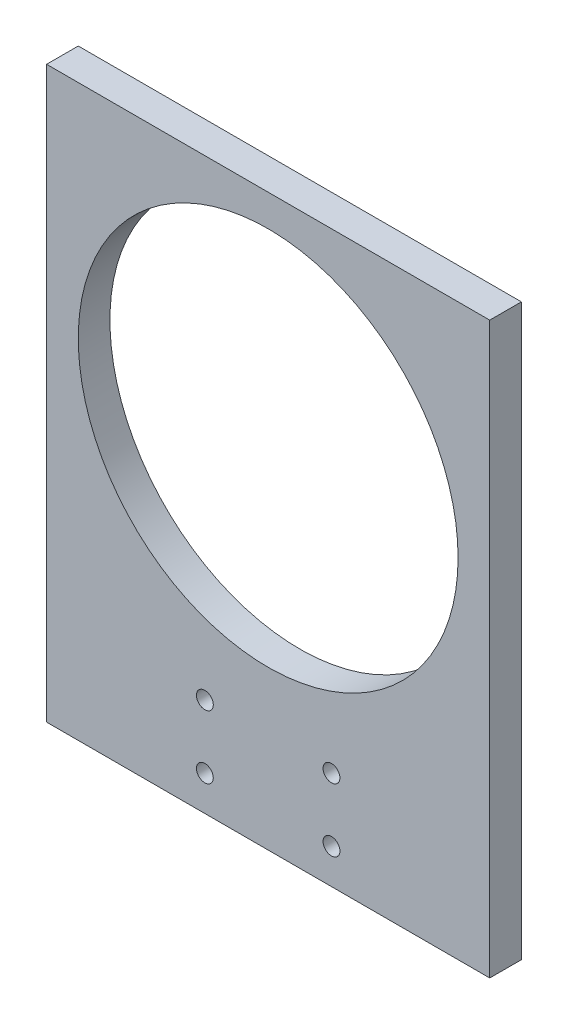
ISO-10303-21;
HEADER;
FILE_DESCRIPTION(('STEP AP214'),'2;1');
FILE_NAME('part.step','',(''),(''),'','','');
FILE_SCHEMA(('AUTOMOTIVE_DESIGN { 1 0 10303 214 1 1 1 1 }'));
ENDSEC;
DATA;
#1=APPLICATION_CONTEXT('core data for automotive mechanical design processes');
#2=APPLICATION_PROTOCOL_DEFINITION('international standard','automotive_design',2000,#1);
#3=PRODUCT_CONTEXT('',#1,'mechanical');
#4=PRODUCT('Part','Part','',(#3));
#5=PRODUCT_RELATED_PRODUCT_CATEGORY('part','',(#4));
#6=PRODUCT_DEFINITION_FORMATION('','',#4);
#7=PRODUCT_DEFINITION_CONTEXT('part definition',#1,'design');
#8=PRODUCT_DEFINITION('design','',#6,#7);
#9=PRODUCT_DEFINITION_SHAPE('','',#8);
#10=(LENGTH_UNIT() NAMED_UNIT(*) SI_UNIT(.MILLI.,.METRE.));
#11=(NAMED_UNIT(*) PLANE_ANGLE_UNIT() SI_UNIT($,.RADIAN.));
#12=(NAMED_UNIT(*) SI_UNIT($,.STERADIAN.) SOLID_ANGLE_UNIT());
#13=UNCERTAINTY_MEASURE_WITH_UNIT(LENGTH_MEASURE(1.E-05),#10,'distance_accuracy_value','');
#14=(GEOMETRIC_REPRESENTATION_CONTEXT(3) GLOBAL_UNCERTAINTY_ASSIGNED_CONTEXT((#13)) GLOBAL_UNIT_ASSIGNED_CONTEXT((#10,
#11,#12)) REPRESENTATION_CONTEXT('',''));
#15=CARTESIAN_POINT('',(0.,0.,0.));
#16=DIRECTION('',(0.,0.,1.));
#17=DIRECTION('',(1.,0.,0.));
#18=AXIS2_PLACEMENT_3D('',#15,#16,#17);
#19=CARTESIAN_POINT('',(0.,0.,12.7));
#20=DIRECTION('',(0.,0.,1.));
#21=DIRECTION('',(1.,0.,0.));
#22=AXIS2_PLACEMENT_3D('',#19,#20,#21);
#23=PLANE('',#22);
#24=CARTESIAN_POINT('',(114.3,14.0362831713124,12.7));
#25=DIRECTION('',(0.,0.,-1.));
#26=DIRECTION('',(-1.,0.,0.));
#27=AXIS2_PLACEMENT_3D('',#24,#25,#26);
#28=CIRCLE('',#27,3.37819999999999);
#29=CARTESIAN_POINT('',(110.9218,14.0362831713124,12.7));
#30=VERTEX_POINT('',#29);
#31=EDGE_CURVE('E232',#30,#30,#28,.T.);
#32=ORIENTED_EDGE('',*,*,#31,.T.);
#33=EDGE_LOOP('',(#32));
#34=FACE_BOUND('',#33,.T.);
#35=CARTESIAN_POINT('',(114.3,39.4362831713124,12.7));
#36=DIRECTION('',(0.,0.,-1.));
#37=DIRECTION('',(-1.,0.,0.));
#38=AXIS2_PLACEMENT_3D('',#35,#36,#37);
#39=CIRCLE('',#38,3.37819999999999);
#40=CARTESIAN_POINT('',(110.9218,39.4362831713124,12.7));
#41=VERTEX_POINT('',#40);
#42=EDGE_CURVE('E240',#41,#41,#39,.T.);
#43=ORIENTED_EDGE('',*,*,#42,.T.);
#44=EDGE_LOOP('',(#43));
#45=FACE_BOUND('',#44,.T.);
#46=CARTESIAN_POINT('',(63.5,39.4362831713124,12.7));
#47=DIRECTION('',(0.,0.,1.));
#48=DIRECTION('',(1.,0.,0.));
#49=AXIS2_PLACEMENT_3D('',#46,#47,#48);
#50=CIRCLE('',#49,3.37819999999999);
#51=CARTESIAN_POINT('',(66.8782,39.4362831713124,12.7));
#52=VERTEX_POINT('',#51);
#53=EDGE_CURVE('E252',#52,#52,#50,.T.);
#54=ORIENTED_EDGE('',*,*,#53,.F.);
#55=EDGE_LOOP('',(#54));
#56=FACE_BOUND('',#55,.T.);
#57=DIRECTION('',(1.,0.,0.));
#58=VECTOR('',#57,1.);
#59=CARTESIAN_POINT('',(0.,228.6,12.7));
#60=LINE('',#59,#58);
#61=CARTESIAN_POINT('',(0.,228.6,12.7));
#62=VERTEX_POINT('',#61);
#63=CARTESIAN_POINT('',(177.8,228.6,12.7));
#64=VERTEX_POINT('',#63);
#65=EDGE_CURVE('E171',#62,#64,#60,.T.);
#66=ORIENTED_EDGE('',*,*,#65,.F.);
#67=DIRECTION('',(0.,1.,0.));
#68=VECTOR('',#67,1.);
#69=CARTESIAN_POINT('',(0.,0.,12.7));
#70=LINE('',#69,#68);
#71=CARTESIAN_POINT('',(0.,0.,12.7));
#72=VERTEX_POINT('',#71);
#73=EDGE_CURVE('E161',#72,#62,#70,.T.);
#74=ORIENTED_EDGE('',*,*,#73,.F.);
#75=DIRECTION('',(1.,0.,0.));
#76=VECTOR('',#75,1.);
#77=CARTESIAN_POINT('',(0.,0.,12.7));
#78=LINE('',#77,#76);
#79=CARTESIAN_POINT('',(177.8,0.,12.7));
#80=VERTEX_POINT('',#79);
#81=EDGE_CURVE('E158',#72,#80,#78,.T.);
#82=ORIENTED_EDGE('',*,*,#81,.T.);
#83=DIRECTION('',(0.,1.,0.));
#84=VECTOR('',#83,1.);
#85=CARTESIAN_POINT('',(177.8,0.,12.7));
#86=LINE('',#85,#84);
#87=EDGE_CURVE('E155',#80,#64,#86,.T.);
#88=ORIENTED_EDGE('',*,*,#87,.T.);
#89=EDGE_LOOP('',(#66,#74,#82,#88));
#90=FACE_BOUND('',#89,.T.);
#91=CARTESIAN_POINT('',(88.9,139.7,12.7));
#92=DIRECTION('',(0.,0.,1.));
#93=DIRECTION('',(1.,0.,0.));
#94=AXIS2_PLACEMENT_3D('',#91,#92,#93);
#95=CIRCLE('',#94,76.2);
#96=CARTESIAN_POINT('',(165.1,139.7,12.7));
#97=VERTEX_POINT('',#96);
#98=EDGE_CURVE('E182',#97,#97,#95,.T.);
#99=ORIENTED_EDGE('',*,*,#98,.F.);
#100=EDGE_LOOP('',(#99));
#101=FACE_BOUND('',#100,.T.);
#102=CARTESIAN_POINT('',(63.5,14.0362831713124,12.7));
#103=DIRECTION('',(0.,0.,1.));
#104=DIRECTION('',(1.,0.,0.));
#105=AXIS2_PLACEMENT_3D('',#102,#103,#104);
#106=CIRCLE('',#105,3.37819999999999);
#107=CARTESIAN_POINT('',(66.8782,14.0362831713124,12.7));
#108=VERTEX_POINT('',#107);
#109=EDGE_CURVE('E246',#108,#108,#106,.T.);
#110=ORIENTED_EDGE('',*,*,#109,.F.);
#111=EDGE_LOOP('',(#110));
#112=FACE_BOUND('',#111,.T.);
#113=ADVANCED_FACE('F112',(#34,#45,#56,#90,#101,#112),#23,.T.);
#114=CARTESIAN_POINT('',(0.,0.,0.));
#115=DIRECTION('',(0.,0.,1.));
#116=DIRECTION('',(1.,0.,0.));
#117=AXIS2_PLACEMENT_3D('',#114,#115,#116);
#118=PLANE('',#117);
#119=CARTESIAN_POINT('',(114.3,14.0362831713124,0.));
#120=DIRECTION('',(0.,0.,-1.));
#121=DIRECTION('',(-1.,0.,0.));
#122=AXIS2_PLACEMENT_3D('',#119,#120,#121);
#123=CIRCLE('',#122,3.37819999999999);
#124=CARTESIAN_POINT('',(110.9218,14.0362831713124,0.));
#125=VERTEX_POINT('',#124);
#126=EDGE_CURVE('E235',#125,#125,#123,.T.);
#127=ORIENTED_EDGE('',*,*,#126,.F.);
#128=EDGE_LOOP('',(#127));
#129=FACE_BOUND('',#128,.T.);
#130=CARTESIAN_POINT('',(114.3,39.4362831713124,0.));
#131=DIRECTION('',(0.,0.,-1.));
#132=DIRECTION('',(-1.,0.,0.));
#133=AXIS2_PLACEMENT_3D('',#130,#131,#132);
#134=CIRCLE('',#133,3.37819999999999);
#135=CARTESIAN_POINT('',(110.9218,39.4362831713124,0.));
#136=VERTEX_POINT('',#135);
#137=EDGE_CURVE('E237',#136,#136,#134,.T.);
#138=ORIENTED_EDGE('',*,*,#137,.F.);
#139=EDGE_LOOP('',(#138));
#140=FACE_BOUND('',#139,.T.);
#141=DIRECTION('',(1.,0.,0.));
#142=VECTOR('',#141,1.);
#143=CARTESIAN_POINT('',(0.,228.6,0.));
#144=LINE('',#143,#142);
#145=CARTESIAN_POINT('',(0.,228.6,0.));
#146=VERTEX_POINT('',#145);
#147=CARTESIAN_POINT('',(177.8,228.6,0.));
#148=VERTEX_POINT('',#147);
#149=EDGE_CURVE('E178',#146,#148,#144,.T.);
#150=ORIENTED_EDGE('',*,*,#149,.T.);
#151=DIRECTION('',(0.,1.,0.));
#152=VECTOR('',#151,1.);
#153=CARTESIAN_POINT('',(177.8,0.,0.));
#154=LINE('',#153,#152);
#155=CARTESIAN_POINT('',(177.8,0.,0.));
#156=VERTEX_POINT('',#155);
#157=EDGE_CURVE('E181',#156,#148,#154,.T.);
#158=ORIENTED_EDGE('',*,*,#157,.F.);
#159=DIRECTION('',(1.,0.,0.));
#160=VECTOR('',#159,1.);
#161=CARTESIAN_POINT('',(0.,0.,0.));
#162=LINE('',#161,#160);
#163=CARTESIAN_POINT('',(0.,0.,0.));
#164=VERTEX_POINT('',#163);
#165=EDGE_CURVE('E166',#164,#156,#162,.T.);
#166=ORIENTED_EDGE('',*,*,#165,.F.);
#167=DIRECTION('',(0.,1.,0.));
#168=VECTOR('',#167,1.);
#169=CARTESIAN_POINT('',(0.,0.,0.));
#170=LINE('',#169,#168);
#171=EDGE_CURVE('E173',#164,#146,#170,.T.);
#172=ORIENTED_EDGE('',*,*,#171,.T.);
#173=EDGE_LOOP('',(#150,#158,#166,#172));
#174=FACE_BOUND('',#173,.T.);
#175=CARTESIAN_POINT('',(88.9,139.7,0.));
#176=DIRECTION('',(0.,0.,1.));
#177=DIRECTION('',(1.,0.,0.));
#178=AXIS2_PLACEMENT_3D('',#175,#176,#177);
#179=CIRCLE('',#178,76.2);
#180=CARTESIAN_POINT('',(165.1,139.7,0.));
#181=VERTEX_POINT('',#180);
#182=EDGE_CURVE('E255',#181,#181,#179,.T.);
#183=ORIENTED_EDGE('',*,*,#182,.T.);
#184=EDGE_LOOP('',(#183));
#185=FACE_BOUND('',#184,.T.);
#186=CARTESIAN_POINT('',(63.5,39.4362831713124,0.));
#187=DIRECTION('',(0.,0.,1.));
#188=DIRECTION('',(1.,0.,0.));
#189=AXIS2_PLACEMENT_3D('',#186,#187,#188);
#190=CIRCLE('',#189,3.37819999999999);
#191=CARTESIAN_POINT('',(66.8782,39.4362831713124,0.));
#192=VERTEX_POINT('',#191);
#193=EDGE_CURVE('E249',#192,#192,#190,.T.);
#194=ORIENTED_EDGE('',*,*,#193,.T.);
#195=EDGE_LOOP('',(#194));
#196=FACE_BOUND('',#195,.T.);
#197=CARTESIAN_POINT('',(63.5,14.0362831713124,0.));
#198=DIRECTION('',(0.,0.,1.));
#199=DIRECTION('',(1.,0.,0.));
#200=AXIS2_PLACEMENT_3D('',#197,#198,#199);
#201=CIRCLE('',#200,3.37819999999999);
#202=CARTESIAN_POINT('',(66.8782,14.0362831713124,0.));
#203=VERTEX_POINT('',#202);
#204=EDGE_CURVE('E243',#203,#203,#201,.T.);
#205=ORIENTED_EDGE('',*,*,#204,.T.);
#206=EDGE_LOOP('',(#205));
#207=FACE_BOUND('',#206,.T.);
#208=ADVANCED_FACE('F188',(#129,#140,#174,#185,#196,#207),#118,.F.);
#209=CARTESIAN_POINT('',(0.,228.6,12.7));
#210=DIRECTION('',(0.,1.,0.));
#211=DIRECTION('',(0.,0.,1.));
#212=AXIS2_PLACEMENT_3D('',#209,#210,#211);
#213=PLANE('',#212);
#214=ORIENTED_EDGE('',*,*,#149,.F.);
#215=DIRECTION('',(0.,0.,-1.));
#216=VECTOR('',#215,1.);
#217=CARTESIAN_POINT('',(0.,228.6,12.7));
#218=LINE('',#217,#216);
#219=EDGE_CURVE('E12',#62,#146,#218,.T.);
#220=ORIENTED_EDGE('',*,*,#219,.F.);
#221=ORIENTED_EDGE('',*,*,#65,.T.);
#222=DIRECTION('',(0.,0.,-1.));
#223=VECTOR('',#222,1.);
#224=CARTESIAN_POINT('',(177.8,228.6,12.7));
#225=LINE('',#224,#223);
#226=EDGE_CURVE('E116',#64,#148,#225,.T.);
#227=ORIENTED_EDGE('',*,*,#226,.T.);
#228=EDGE_LOOP('',(#214,#220,#221,#227));
#229=FACE_BOUND('',#228,.T.);
#230=ADVANCED_FACE('F114',(#229),#213,.T.);
#231=CARTESIAN_POINT('',(0.,0.,12.7));
#232=DIRECTION('',(-1.,0.,0.));
#233=DIRECTION('',(0.,0.,1.));
#234=AXIS2_PLACEMENT_3D('',#231,#232,#233);
#235=PLANE('',#234);
#236=ORIENTED_EDGE('',*,*,#171,.F.);
#237=DIRECTION('',(0.,0.,-1.));
#238=VECTOR('',#237,1.);
#239=CARTESIAN_POINT('',(0.,0.,12.7));
#240=LINE('',#239,#238);
#241=EDGE_CURVE('E122',#72,#164,#240,.T.);
#242=ORIENTED_EDGE('',*,*,#241,.F.);
#243=ORIENTED_EDGE('',*,*,#73,.T.);
#244=ORIENTED_EDGE('',*,*,#219,.T.);
#245=EDGE_LOOP('',(#236,#242,#243,#244));
#246=FACE_BOUND('',#245,.T.);
#247=ADVANCED_FACE('F190',(#246),#235,.T.);
#248=CARTESIAN_POINT('',(0.,0.,12.7));
#249=DIRECTION('',(0.,1.,0.));
#250=DIRECTION('',(0.,0.,1.));
#251=AXIS2_PLACEMENT_3D('',#248,#249,#250);
#252=PLANE('',#251);
#253=ORIENTED_EDGE('',*,*,#165,.T.);
#254=DIRECTION('',(0.,0.,-1.));
#255=VECTOR('',#254,1.);
#256=CARTESIAN_POINT('',(177.8,0.,12.7));
#257=LINE('',#256,#255);
#258=EDGE_CURVE('E164',#80,#156,#257,.T.);
#259=ORIENTED_EDGE('',*,*,#258,.F.);
#260=ORIENTED_EDGE('',*,*,#81,.F.);
#261=ORIENTED_EDGE('',*,*,#241,.T.);
#262=EDGE_LOOP('',(#253,#259,#260,#261));
#263=FACE_BOUND('',#262,.T.);
#264=ADVANCED_FACE('F165',(#263),#252,.F.);
#265=CARTESIAN_POINT('',(177.8,0.,12.7));
#266=DIRECTION('',(-1.,0.,0.));
#267=DIRECTION('',(0.,-1.,0.));
#268=AXIS2_PLACEMENT_3D('',#265,#266,#267);
#269=PLANE('',#268);
#270=ORIENTED_EDGE('',*,*,#157,.T.);
#271=ORIENTED_EDGE('',*,*,#226,.F.);
#272=ORIENTED_EDGE('',*,*,#87,.F.);
#273=ORIENTED_EDGE('',*,*,#258,.T.);
#274=EDGE_LOOP('',(#270,#271,#272,#273));
#275=FACE_BOUND('',#274,.T.);
#276=ADVANCED_FACE('F170',(#275),#269,.F.);
#277=CARTESIAN_POINT('',(88.9,139.7,12.7));
#278=DIRECTION('',(0.,0.,-1.));
#279=DIRECTION('',(-1.,0.,0.));
#280=AXIS2_PLACEMENT_3D('',#277,#278,#279);
#281=CYLINDRICAL_SURFACE('',#280,76.2);
#282=ORIENTED_EDGE('',*,*,#98,.T.);
#283=EDGE_LOOP('',(#282));
#284=FACE_BOUND('',#283,.T.);
#285=ORIENTED_EDGE('',*,*,#182,.F.);
#286=EDGE_LOOP('',(#285));
#287=FACE_BOUND('',#286,.T.);
#288=ADVANCED_FACE('F209',(#284,#287),#281,.F.);
#289=CARTESIAN_POINT('',(63.5,39.4362831713124,12.7));
#290=DIRECTION('',(0.,0.,-1.));
#291=DIRECTION('',(-1.,0.,0.));
#292=AXIS2_PLACEMENT_3D('',#289,#290,#291);
#293=CYLINDRICAL_SURFACE('',#292,3.37819999999999);
#294=ORIENTED_EDGE('',*,*,#53,.T.);
#295=EDGE_LOOP('',(#294));
#296=FACE_BOUND('',#295,.T.);
#297=ORIENTED_EDGE('',*,*,#193,.F.);
#298=EDGE_LOOP('',(#297));
#299=FACE_BOUND('',#298,.T.);
#300=ADVANCED_FACE('F212',(#296,#299),#293,.F.);
#301=CARTESIAN_POINT('',(63.5,14.0362831713124,12.7));
#302=DIRECTION('',(0.,0.,-1.));
#303=DIRECTION('',(-1.,0.,0.));
#304=AXIS2_PLACEMENT_3D('',#301,#302,#303);
#305=CYLINDRICAL_SURFACE('',#304,3.37819999999999);
#306=ORIENTED_EDGE('',*,*,#109,.T.);
#307=EDGE_LOOP('',(#306));
#308=FACE_BOUND('',#307,.T.);
#309=ORIENTED_EDGE('',*,*,#204,.F.);
#310=EDGE_LOOP('',(#309));
#311=FACE_BOUND('',#310,.T.);
#312=ADVANCED_FACE('F216',(#308,#311),#305,.F.);
#313=CARTESIAN_POINT('',(114.3,39.4362831713124,12.7));
#314=DIRECTION('',(0.,0.,-1.));
#315=DIRECTION('',(-1.,0.,0.));
#316=AXIS2_PLACEMENT_3D('',#313,#314,#315);
#317=CYLINDRICAL_SURFACE('',#316,3.37819999999999);
#318=ORIENTED_EDGE('',*,*,#42,.F.);
#319=EDGE_LOOP('',(#318));
#320=FACE_BOUND('',#319,.T.);
#321=ORIENTED_EDGE('',*,*,#137,.T.);
#322=EDGE_LOOP('',(#321));
#323=FACE_BOUND('',#322,.T.);
#324=ADVANCED_FACE('F220',(#320,#323),#317,.F.);
#325=CARTESIAN_POINT('',(114.3,14.0362831713124,12.7));
#326=DIRECTION('',(0.,0.,-1.));
#327=DIRECTION('',(-1.,0.,0.));
#328=AXIS2_PLACEMENT_3D('',#325,#326,#327);
#329=CYLINDRICAL_SURFACE('',#328,3.37819999999999);
#330=ORIENTED_EDGE('',*,*,#31,.F.);
#331=EDGE_LOOP('',(#330));
#332=FACE_BOUND('',#331,.T.);
#333=ORIENTED_EDGE('',*,*,#126,.T.);
#334=EDGE_LOOP('',(#333));
#335=FACE_BOUND('',#334,.T.);
#336=ADVANCED_FACE('F224',(#332,#335),#329,.F.);
#337=CLOSED_SHELL('',(#113,#208,#230,#247,#264,#276,#288,#300,#312,#324,#336));
#338=MANIFOLD_SOLID_BREP('B2',#337);
#339=ADVANCED_BREP_SHAPE_REPRESENTATION('',(#18,#338),#14);
#340=SHAPE_DEFINITION_REPRESENTATION(#9,#339);
ENDSEC;
END-ISO-10303-21;
